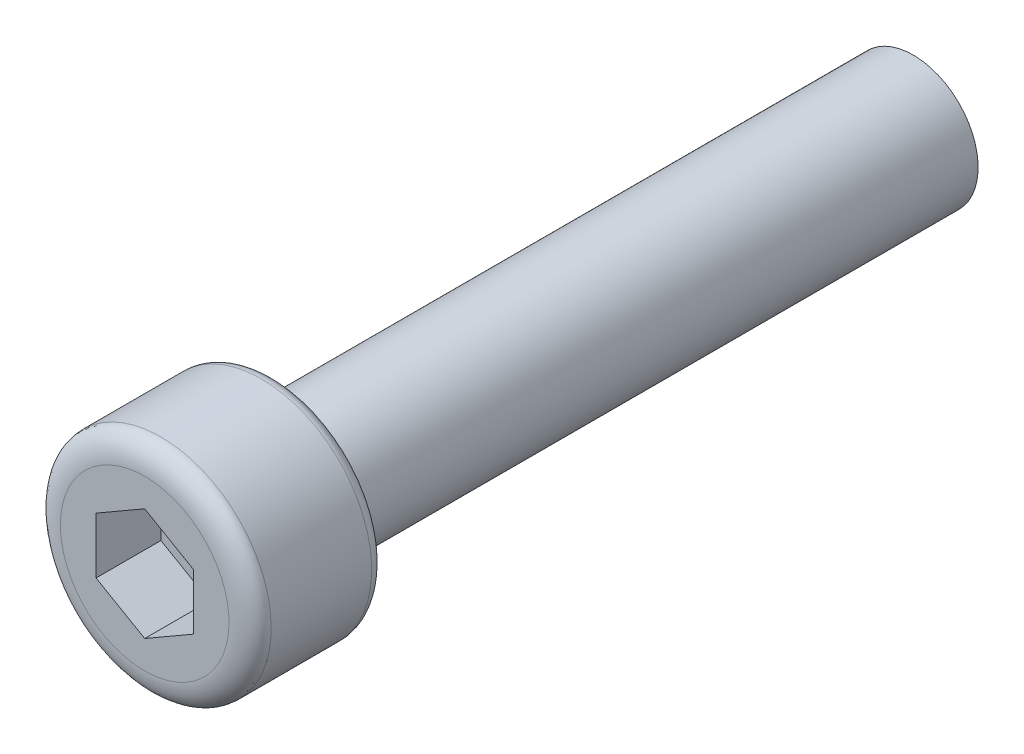
ISO-10303-21;
HEADER;
FILE_DESCRIPTION(('STEP AP214'),'2;1');
FILE_NAME('part.step','',(''),(''),'','','');
FILE_SCHEMA(('AUTOMOTIVE_DESIGN { 1 0 10303 214 1 1 1 1 }'));
ENDSEC;
DATA;
#1=APPLICATION_CONTEXT('core data for automotive mechanical design processes');
#2=APPLICATION_PROTOCOL_DEFINITION('international standard','automotive_design',2000,#1);
#3=PRODUCT_CONTEXT('',#1,'mechanical');
#4=PRODUCT('Part','Part','',(#3));
#5=PRODUCT_RELATED_PRODUCT_CATEGORY('part','',(#4));
#6=PRODUCT_DEFINITION_FORMATION('','',#4);
#7=PRODUCT_DEFINITION_CONTEXT('part definition',#1,'design');
#8=PRODUCT_DEFINITION('design','',#6,#7);
#9=PRODUCT_DEFINITION_SHAPE('','',#8);
#10=(LENGTH_UNIT() NAMED_UNIT(*) SI_UNIT(.MILLI.,.METRE.));
#11=(NAMED_UNIT(*) PLANE_ANGLE_UNIT() SI_UNIT($,.RADIAN.));
#12=(NAMED_UNIT(*) SI_UNIT($,.STERADIAN.) SOLID_ANGLE_UNIT());
#13=UNCERTAINTY_MEASURE_WITH_UNIT(LENGTH_MEASURE(1.E-05),#10,'distance_accuracy_value','');
#14=(GEOMETRIC_REPRESENTATION_CONTEXT(3) GLOBAL_UNCERTAINTY_ASSIGNED_CONTEXT((#13)) GLOBAL_UNIT_ASSIGNED_CONTEXT((#10,
#11,#12)) REPRESENTATION_CONTEXT('',''));
#15=CARTESIAN_POINT('',(0.,0.,0.));
#16=DIRECTION('',(0.,0.,1.));
#17=DIRECTION('',(1.,0.,0.));
#18=AXIS2_PLACEMENT_3D('',#15,#16,#17);
#19=CARTESIAN_POINT('',(0.,0.,12.));
#20=DIRECTION('',(0.,0.,1.));
#21=DIRECTION('',(1.,0.,0.));
#22=AXIS2_PLACEMENT_3D('',#19,#20,#21);
#23=PLANE('',#22);
#24=DIRECTION('',(-0.866025403784439,0.5,0.));
#25=VECTOR('',#24,1.);
#26=CARTESIAN_POINT('',(1.5,0.86602540378444,12.));
#27=LINE('',#26,#25);
#28=CARTESIAN_POINT('',(1.5,0.86602540378444,12.));
#29=VERTEX_POINT('',#28);
#30=CARTESIAN_POINT('',(0.,1.73205080756888,12.));
#31=VERTEX_POINT('',#30);
#32=EDGE_CURVE('E58',#29,#31,#27,.T.);
#33=ORIENTED_EDGE('',*,*,#32,.F.);
#34=DIRECTION('',(0.,1.,0.));
#35=VECTOR('',#34,1.);
#36=CARTESIAN_POINT('',(1.5,-0.866025403784439,12.));
#37=LINE('',#36,#35);
#38=CARTESIAN_POINT('',(1.5,-0.866025403784439,12.));
#39=VERTEX_POINT('',#38);
#40=EDGE_CURVE('E141',#39,#29,#37,.T.);
#41=ORIENTED_EDGE('',*,*,#40,.F.);
#42=DIRECTION('',(0.866025403784439,0.5,0.));
#43=VECTOR('',#42,1.);
#44=CARTESIAN_POINT('',(0.,-1.73205080756888,12.));
#45=LINE('',#44,#43);
#46=CARTESIAN_POINT('',(0.,-1.73205080756888,12.));
#47=VERTEX_POINT('',#46);
#48=EDGE_CURVE('E139',#47,#39,#45,.T.);
#49=ORIENTED_EDGE('',*,*,#48,.F.);
#50=DIRECTION('',(0.866025403784438,-0.5,0.));
#51=VECTOR('',#50,1.);
#52=CARTESIAN_POINT('',(-1.5,-0.866025403784438,12.));
#53=LINE('',#52,#51);
#54=CARTESIAN_POINT('',(-1.5,-0.866025403784438,12.));
#55=VERTEX_POINT('',#54);
#56=EDGE_CURVE('E106',#55,#47,#53,.T.);
#57=ORIENTED_EDGE('',*,*,#56,.F.);
#58=DIRECTION('',(0.,-1.,0.));
#59=VECTOR('',#58,1.);
#60=CARTESIAN_POINT('',(-1.5,0.866025403784439,12.));
#61=LINE('',#60,#59);
#62=CARTESIAN_POINT('',(-1.5,0.866025403784439,12.));
#63=VERTEX_POINT('',#62);
#64=EDGE_CURVE('E135',#63,#55,#61,.T.);
#65=ORIENTED_EDGE('',*,*,#64,.F.);
#66=DIRECTION('',(-0.866025403784439,-0.5,0.));
#67=VECTOR('',#66,1.);
#68=CARTESIAN_POINT('',(0.,1.73205080756888,12.));
#69=LINE('',#68,#67);
#70=EDGE_CURVE('E132',#31,#63,#69,.T.);
#71=ORIENTED_EDGE('',*,*,#70,.F.);
#72=EDGE_LOOP('',(#33,#41,#49,#57,#65,#71));
#73=FACE_BOUND('',#72,.T.);
#74=CARTESIAN_POINT('',(-2.6,0.,12.));
#75=CARTESIAN_POINT('',(-2.6,0.340339195747886,12.));
#76=CARTESIAN_POINT('',(-2.53232895612653,0.680544507086381,12.));
#77=CARTESIAN_POINT('',(-2.27184461293216,1.30940934121209,12.));
#78=CARTESIAN_POINT('',(-2.07913378430194,1.59782147786807,12.));
#79=CARTESIAN_POINT('',(-1.59782147786811,2.07913378430197,12.));
#80=CARTESIAN_POINT('',(-1.30940934121209,2.27184461293216,12.));
#81=CARTESIAN_POINT('',(-0.680544507086378,2.53232895612653,12.));
#82=CARTESIAN_POINT('',(-0.340339195747888,2.6,12.));
#83=CARTESIAN_POINT('',(0.340339195747889,2.6,12.));
#84=CARTESIAN_POINT('',(0.680544507086413,2.53232895612653,12.));
#85=CARTESIAN_POINT('',(1.30940934121205,2.27184461293216,12.));
#86=CARTESIAN_POINT('',(1.5978214778681,2.07913378430191,12.));
#87=CARTESIAN_POINT('',(2.07913378430195,1.59782147786813,12.));
#88=CARTESIAN_POINT('',(2.27184461293214,1.30940934121206,12.));
#89=CARTESIAN_POINT('',(2.53232895612655,0.680544507086403,12.));
#90=CARTESIAN_POINT('',(2.6,0.340339195748112,12.));
#91=CARTESIAN_POINT('',(2.6,-0.340339195748117,12.));
#92=CARTESIAN_POINT('',(2.53232895612663,-0.680544507086149,12.));
#93=CARTESIAN_POINT('',(2.27184461293207,-1.30940934121232,12.));
#94=CARTESIAN_POINT('',(2.0791337843018,-1.59782147786829,12.));
#95=CARTESIAN_POINT('',(1.59782147786825,-2.07913378430177,12.));
#96=CARTESIAN_POINT('',(1.30940934121224,-2.27184461293209,12.));
#97=CARTESIAN_POINT('',(0.68054450708623,-2.53232895612661,12.));
#98=CARTESIAN_POINT('',(0.340339195748087,-2.6,12.));
#99=CARTESIAN_POINT('',(-0.340339195748083,-2.6,12.));
#100=CARTESIAN_POINT('',(-0.680544507086233,-2.53232895612661,12.));
#101=CARTESIAN_POINT('',(-1.30940934121224,-2.27184461293209,12.));
#102=CARTESIAN_POINT('',(-1.59782147786814,-2.07913378430194,12.));
#103=CARTESIAN_POINT('',(-2.0791337843019,-1.59782147786811,12.));
#104=CARTESIAN_POINT('',(-2.27184461293223,-1.30940934121201,12.));
#105=CARTESIAN_POINT('',(-2.53232895612646,-0.680544507086453,12.));
#106=CARTESIAN_POINT('',(-2.6,-0.340339195747891,12.));
#107=CARTESIAN_POINT('',(-2.6,0.,12.));
#108=(BOUNDED_CURVE() B_SPLINE_CURVE(3,(#74,#75,#76,#77,#78,#79,#80,#81,#82,#83,#84,#85,#86,#87,
#88,#89,#90,#91,#92,#93,#94,#95,#96,#97,#98,#99,#100,#101,#102,#103,#104,#105,#106,#107),
.UNSPECIFIED.,.T.,.F.) B_SPLINE_CURVE_WITH_KNOTS((4,2,2,2,2,2,2,2,2,2,2,2,2,2,2,2,4),
(-3.14159265358979,-2.74889357189107,-2.35619449019234,-1.96349540849362,-1.5707963267949,
-1.17809724509617,-0.785398163397448,-0.392699081698724,0.,0.392699081698724,0.785398163397448,
1.17809724509617,1.5707963267949,1.96349540849362,2.35619449019234,2.74889357189107,
3.14159265358979),
.UNSPECIFIED.) CURVE() GEOMETRIC_REPRESENTATION_ITEM() RATIONAL_B_SPLINE_CURVE((1.,1.,1.,1.,1.,
1.,1.,1.,1.,1.,1.,1.,1.,1.,1.,1.,1.,1.,1.,1.,1.,1.,1.,1.,1.,1.,1.,1.,1.,1.,1.,1.,1.,1.)) REPRESENTATION_ITEM(''));
#109=CARTESIAN_POINT('',(-2.6,0.,12.));
#110=VERTEX_POINT('',#109);
#111=EDGE_CURVE('E12',#110,#110,#108,.F.);
#112=ORIENTED_EDGE('',*,*,#111,.T.);
#113=EDGE_LOOP('',(#112));
#114=FACE_BOUND('',#113,.T.);
#115=ADVANCED_FACE('F37',(#73,#114),#23,.T.);
#116=CARTESIAN_POINT('',(0.,0.,-12.));
#117=DIRECTION('',(0.,0.,-1.));
#118=DIRECTION('',(-1.,0.,0.));
#119=AXIS2_PLACEMENT_3D('',#116,#117,#118);
#120=CYLINDRICAL_SURFACE('',#119,3.4);
#121=CARTESIAN_POINT('',(-3.4,0.,11.5));
#122=CARTESIAN_POINT('',(-3.4,-0.445058948285703,11.5));
#123=CARTESIAN_POINT('',(-3.31150709647311,-0.889942816959229,11.5));
#124=CARTESIAN_POINT('',(-2.97087372460365,-1.71230452312338,11.5));
#125=CARTESIAN_POINT('',(-2.71886725639482,-2.08945885567371,11.5));
#126=CARTESIAN_POINT('',(-2.0894588556737,-2.71886725639483,11.5));
#127=CARTESIAN_POINT('',(-1.71230452312369,-2.97087372460351,11.5));
#128=CARTESIAN_POINT('',(-0.889942816958928,-3.31150709647324,11.5));
#129=CARTESIAN_POINT('',(-0.445058948285955,-3.4,11.5));
#130=CARTESIAN_POINT('',(0.44505894828596,-3.4,11.5));
#131=CARTESIAN_POINT('',(0.889942816958893,-3.31150709647325,11.5));
#132=CARTESIAN_POINT('',(1.71230452312372,-2.9708737246035,11.5));
#133=CARTESIAN_POINT('',(2.08945885567389,-2.71886725639464,11.5));
#134=CARTESIAN_POINT('',(2.71886725639464,-2.08945885567389,11.5));
#135=CARTESIAN_POINT('',(2.97087372460347,-1.71230452312381,11.5));
#136=CARTESIAN_POINT('',(3.31150709647329,-0.889942816958808,11.5));
#137=CARTESIAN_POINT('',(3.4,-0.445058948285998,11.5));
#138=CARTESIAN_POINT('',(3.4,0.445058948285993,11.5));
#139=CARTESIAN_POINT('',(3.31150709647316,0.889942816959108,11.5));
#140=CARTESIAN_POINT('',(2.97087372460359,1.7123045231235,11.5));
#141=CARTESIAN_POINT('',(2.71886725639482,2.0894588556737,11.5));
#142=CARTESIAN_POINT('',(2.0894588556737,2.71886725639482,11.5));
#143=CARTESIAN_POINT('',(1.71230452312347,2.9708737246036,11.5));
#144=CARTESIAN_POINT('',(0.889942816959137,3.31150709647315,11.5));
#145=CARTESIAN_POINT('',(0.4450589482857,3.4,11.5));
#146=CARTESIAN_POINT('',(-0.4450589482857,3.4,11.5));
#147=CARTESIAN_POINT('',(-0.889942816959102,3.31150709647316,11.5));
#148=CARTESIAN_POINT('',(-1.71230452312351,2.97087372460359,11.5));
#149=CARTESIAN_POINT('',(-2.08945885567371,2.71886725639482,11.5));
#150=CARTESIAN_POINT('',(-2.71886725639482,2.0894588556737,11.5));
#151=CARTESIAN_POINT('',(-2.97087372460359,1.7123045231235,11.5));
#152=CARTESIAN_POINT('',(-3.31150709647316,0.889942816959118,11.5));
#153=CARTESIAN_POINT('',(-3.4,0.445058948285698,11.5));
#154=CARTESIAN_POINT('',(-3.4,0.,11.5));
#155=(BOUNDED_CURVE() B_SPLINE_CURVE(3,(#121,#122,#123,#124,#125,#126,#127,#128,#129,#130,#131,
#132,#133,#134,#135,#136,#137,#138,#139,#140,#141,#142,#143,#144,#145,#146,#147,#148,#149,#150,
#151,#152,#153,#154),.UNSPECIFIED.,.T.,.F.) B_SPLINE_CURVE_WITH_KNOTS((4,2,2,2,2,2,2,2,2,2,2,2,
2,2,2,2,4),(-3.14159265358979,-2.74889357189107,-2.35619449019234,-1.96349540849362,
-1.5707963267949,-1.17809724509617,-0.785398163397448,-0.392699081698724,0.,0.392699081698724,
0.785398163397448,1.17809724509617,1.5707963267949,1.96349540849362,2.35619449019234,
2.74889357189107,3.14159265358979),
.UNSPECIFIED.) CURVE() GEOMETRIC_REPRESENTATION_ITEM() RATIONAL_B_SPLINE_CURVE((1.,1.,1.,1.,1.,
1.,1.,1.,1.,1.,1.,1.,1.,1.,1.,1.,1.,1.,1.,1.,1.,1.,1.,1.,1.,1.,1.,1.,1.,1.,1.,1.,1.,1.)) REPRESENTATION_ITEM(''));
#156=CARTESIAN_POINT('',(-3.4,0.,11.5));
#157=VERTEX_POINT('',#156);
#158=EDGE_CURVE('E51',#157,#157,#155,.F.);
#159=ORIENTED_EDGE('',*,*,#158,.T.);
#160=EDGE_LOOP('',(#159));
#161=FACE_BOUND('',#160,.T.);
#162=CARTESIAN_POINT('',(0.,0.,8.4));
#163=DIRECTION('',(0.,0.,-1.));
#164=DIRECTION('',(-1.,0.,0.));
#165=AXIS2_PLACEMENT_3D('',#162,#163,#164);
#166=CIRCLE('',#165,3.4);
#167=CARTESIAN_POINT('',(-3.4,0.,8.4));
#168=VERTEX_POINT('',#167);
#169=EDGE_CURVE('E162',#168,#168,#166,.F.);
#170=ORIENTED_EDGE('',*,*,#169,.T.);
#171=EDGE_LOOP('',(#170));
#172=FACE_BOUND('',#171,.T.);
#173=ADVANCED_FACE('F174',(#161,#172),#120,.T.);
#174=CARTESIAN_POINT('',(0.,3.4,8.));
#175=DIRECTION('',(0.,0.,-1.));
#176=DIRECTION('',(-1.,0.,0.));
#177=AXIS2_PLACEMENT_3D('',#174,#175,#176);
#178=PLANE('',#177);
#179=CARTESIAN_POINT('',(0.,0.,8.));
#180=DIRECTION('',(0.,0.,-1.));
#181=DIRECTION('',(-1.,0.,0.));
#182=AXIS2_PLACEMENT_3D('',#179,#180,#181);
#183=CIRCLE('',#182,3.);
#184=CARTESIAN_POINT('',(-3.,0.,8.));
#185=VERTEX_POINT('',#184);
#186=EDGE_CURVE('E159',#185,#185,#183,.T.);
#187=ORIENTED_EDGE('',*,*,#186,.T.);
#188=EDGE_LOOP('',(#187));
#189=FACE_BOUND('',#188,.T.);
#190=CARTESIAN_POINT('',(0.,0.,8.));
#191=DIRECTION('',(0.,0.,-1.));
#192=DIRECTION('',(-1.,0.,0.));
#193=AXIS2_PLACEMENT_3D('',#190,#191,#192);
#194=CIRCLE('',#193,2.);
#195=CARTESIAN_POINT('',(-2.,0.,8.));
#196=VERTEX_POINT('',#195);
#197=EDGE_CURVE('E145',#196,#196,#194,.T.);
#198=ORIENTED_EDGE('',*,*,#197,.F.);
#199=EDGE_LOOP('',(#198));
#200=FACE_BOUND('',#199,.T.);
#201=ADVANCED_FACE('F184',(#189,#200),#178,.T.);
#202=CARTESIAN_POINT('',(0.,0.,-12.));
#203=DIRECTION('',(0.,0.,-1.));
#204=DIRECTION('',(-1.,0.,0.));
#205=AXIS2_PLACEMENT_3D('',#202,#203,#204);
#206=CYLINDRICAL_SURFACE('',#205,2.);
#207=CARTESIAN_POINT('',(0.,0.,-11.7));
#208=DIRECTION('',(0.,0.,-1.));
#209=DIRECTION('',(-1.,0.,0.));
#210=AXIS2_PLACEMENT_3D('',#207,#208,#209);
#211=CIRCLE('',#210,2.);
#212=CARTESIAN_POINT('',(-2.,0.,-11.7));
#213=VERTEX_POINT('',#212);
#214=EDGE_CURVE('E156',#213,#213,#211,.F.);
#215=ORIENTED_EDGE('',*,*,#214,.T.);
#216=EDGE_LOOP('',(#215));
#217=FACE_BOUND('',#216,.T.);
#218=ORIENTED_EDGE('',*,*,#197,.T.);
#219=EDGE_LOOP('',(#218));
#220=FACE_BOUND('',#219,.T.);
#221=ADVANCED_FACE('F233',(#217,#220),#206,.T.);
#222=CARTESIAN_POINT('',(0.,2.,-12.));
#223=DIRECTION('',(0.,0.,-1.));
#224=DIRECTION('',(-1.,0.,0.));
#225=AXIS2_PLACEMENT_3D('',#222,#223,#224);
#226=PLANE('',#225);
#227=CARTESIAN_POINT('',(0.,0.,-12.));
#228=DIRECTION('',(0.,0.,-1.));
#229=DIRECTION('',(-1.,0.,0.));
#230=AXIS2_PLACEMENT_3D('',#227,#228,#229);
#231=CIRCLE('',#230,1.48038475772934);
#232=CARTESIAN_POINT('',(-1.48038475772934,0.,-12.));
#233=VERTEX_POINT('',#232);
#234=EDGE_CURVE('E153',#233,#233,#231,.T.);
#235=ORIENTED_EDGE('',*,*,#234,.T.);
#236=EDGE_LOOP('',(#235));
#237=FACE_BOUND('',#236,.T.);
#238=ADVANCED_FACE('F225',(#237),#226,.T.);
#239=CARTESIAN_POINT('',(0.,0.,-12.));
#240=DIRECTION('',(0.,0.,1.));
#241=DIRECTION('',(1.,0.,0.));
#242=AXIS2_PLACEMENT_3D('',#239,#240,#241);
#243=CONICAL_SURFACE('',#242,1.48038475772934,1.0471975511966);
#244=ORIENTED_EDGE('',*,*,#214,.F.);
#245=EDGE_LOOP('',(#244));
#246=FACE_BOUND('',#245,.T.);
#247=ORIENTED_EDGE('',*,*,#234,.F.);
#248=EDGE_LOOP('',(#247));
#249=FACE_BOUND('',#248,.T.);
#250=ADVANCED_FACE('F191',(#246,#249),#243,.T.);
#251=CARTESIAN_POINT('',(0.,0.,8.4));
#252=DIRECTION('',(0.,0.,-1.));
#253=DIRECTION('',(-1.,0.,0.));
#254=AXIS2_PLACEMENT_3D('',#251,#252,#253);
#255=TOROIDAL_SURFACE('',#254,3.,0.4);
#256=ORIENTED_EDGE('',*,*,#169,.F.);
#257=EDGE_LOOP('',(#256));
#258=FACE_BOUND('',#257,.T.);
#259=ORIENTED_EDGE('',*,*,#186,.F.);
#260=EDGE_LOOP('',(#259));
#261=FACE_BOUND('',#260,.T.);
#262=ADVANCED_FACE('F214',(#258,#261),#255,.T.);
#263=CARTESIAN_POINT('',(-2.6,0.,12.));
#264=CARTESIAN_POINT('',(-2.6,-0.340339195747891,12.));
#265=CARTESIAN_POINT('',(-2.53232895612646,-0.680544507086453,12.));
#266=CARTESIAN_POINT('',(-2.27184461293223,-1.30940934121201,12.));
#267=CARTESIAN_POINT('',(-2.0791337843019,-1.59782147786811,12.));
#268=CARTESIAN_POINT('',(-1.59782147786814,-2.07913378430194,12.));
#269=CARTESIAN_POINT('',(-1.30940934121224,-2.27184461293209,12.));
#270=CARTESIAN_POINT('',(-0.680544507086233,-2.53232895612661,12.));
#271=CARTESIAN_POINT('',(-0.340339195748083,-2.6,12.));
#272=CARTESIAN_POINT('',(0.340339195748087,-2.6,12.));
#273=CARTESIAN_POINT('',(0.68054450708623,-2.53232895612661,12.));
#274=CARTESIAN_POINT('',(1.30940934121224,-2.27184461293209,12.));
#275=CARTESIAN_POINT('',(1.59782147786825,-2.07913378430177,12.));
#276=CARTESIAN_POINT('',(2.0791337843018,-1.59782147786829,12.));
#277=CARTESIAN_POINT('',(2.27184461293207,-1.30940934121232,12.));
#278=CARTESIAN_POINT('',(2.53232895612663,-0.680544507086149,12.));
#279=CARTESIAN_POINT('',(2.6,-0.340339195748117,12.));
#280=CARTESIAN_POINT('',(2.6,0.340339195748112,12.));
#281=CARTESIAN_POINT('',(2.53232895612655,0.680544507086403,12.));
#282=CARTESIAN_POINT('',(2.27184461293214,1.30940934121206,12.));
#283=CARTESIAN_POINT('',(2.07913378430195,1.59782147786813,12.));
#284=CARTESIAN_POINT('',(1.5978214778681,2.07913378430191,12.));
#285=CARTESIAN_POINT('',(1.30940934121205,2.27184461293216,12.));
#286=CARTESIAN_POINT('',(0.680544507086413,2.53232895612653,12.));
#287=CARTESIAN_POINT('',(0.340339195747889,2.6,12.));
#288=CARTESIAN_POINT('',(-0.340339195747888,2.6,12.));
#289=CARTESIAN_POINT('',(-0.680544507086378,2.53232895612653,12.));
#290=CARTESIAN_POINT('',(-1.30940934121209,2.27184461293216,12.));
#291=CARTESIAN_POINT('',(-1.59782147786811,2.07913378430197,12.));
#292=CARTESIAN_POINT('',(-2.07913378430194,1.59782147786807,12.));
#293=CARTESIAN_POINT('',(-2.27184461293216,1.30940934121209,12.));
#294=CARTESIAN_POINT('',(-2.53232895612653,0.680544507086381,12.));
#295=CARTESIAN_POINT('',(-2.6,0.340339195747886,12.));
#296=CARTESIAN_POINT('',(-2.6,0.,12.));
#297=CARTESIAN_POINT('',(-3.4,0.,12.));
#298=CARTESIAN_POINT('',(-3.4,-0.445058948285703,12.));
#299=CARTESIAN_POINT('',(-3.31150709647311,-0.889942816959199,12.));
#300=CARTESIAN_POINT('',(-2.97087372460365,-1.71230452312341,12.));
#301=CARTESIAN_POINT('',(-2.71886725639478,-2.08945885567367,12.));
#302=CARTESIAN_POINT('',(-2.08945885567374,-2.71886725639486,12.));
#303=CARTESIAN_POINT('',(-1.7123045231237,-2.97087372460352,12.));
#304=CARTESIAN_POINT('',(-0.889942816958926,-3.31150709647324,12.));
#305=CARTESIAN_POINT('',(-0.445058948285955,-3.40000000000001,12.));
#306=CARTESIAN_POINT('',(0.44505894828596,-3.40000000000001,12.));
#307=CARTESIAN_POINT('',(0.889942816958886,-3.31150709647324,12.));
#308=CARTESIAN_POINT('',(1.71230452312373,-2.97087372460352,12.));
#309=CARTESIAN_POINT('',(2.08945885567385,-2.71886725639461,12.));
#310=CARTESIAN_POINT('',(2.71886725639468,-2.08945885567392,12.));
#311=CARTESIAN_POINT('',(2.9708737246035,-1.71230452312379,12.));
#312=CARTESIAN_POINT('',(3.31150709647326,-0.889942816958827,12.));
#313=CARTESIAN_POINT('',(3.4,-0.445058948285998,12.));
#314=CARTESIAN_POINT('',(3.4,0.445058948285993,12.));
#315=CARTESIAN_POINT('',(3.31150709647311,0.889942816959118,12.));
#316=CARTESIAN_POINT('',(2.97087372460364,1.71230452312349,12.));
#317=CARTESIAN_POINT('',(2.71886725639482,2.0894588556737,12.));
#318=CARTESIAN_POINT('',(2.0894588556737,2.71886725639482,12.));
#319=CARTESIAN_POINT('',(1.71230452312347,2.97087372460359,12.));
#320=CARTESIAN_POINT('',(0.889942816959142,3.31150709647316,12.));
#321=CARTESIAN_POINT('',(0.445058948285701,3.4,12.));
#322=CARTESIAN_POINT('',(-0.4450589482857,3.4,12.));
#323=CARTESIAN_POINT('',(-0.88994281695907,3.31150709647308,12.));
#324=CARTESIAN_POINT('',(-1.71230452312354,2.97087372460367,12.));
#325=CARTESIAN_POINT('',(-2.08945885567374,2.71886725639486,12.));
#326=CARTESIAN_POINT('',(-2.71886725639479,2.08945885567366,12.));
#327=CARTESIAN_POINT('',(-2.97087372460364,1.71230452312349,12.));
#328=CARTESIAN_POINT('',(-3.31150709647311,0.889942816959129,12.));
#329=CARTESIAN_POINT('',(-3.4,0.445058948285698,12.));
#330=CARTESIAN_POINT('',(-3.4,0.,12.));
#331=CARTESIAN_POINT('',(-3.4,0.,11.5));
#332=CARTESIAN_POINT('',(-3.4,-0.445058948285703,11.5));
#333=CARTESIAN_POINT('',(-3.31150709647311,-0.889942816959229,11.5));
#334=CARTESIAN_POINT('',(-2.97087372460365,-1.71230452312338,11.5));
#335=CARTESIAN_POINT('',(-2.71886725639482,-2.08945885567371,11.5));
#336=CARTESIAN_POINT('',(-2.0894588556737,-2.71886725639483,11.5));
#337=CARTESIAN_POINT('',(-1.71230452312369,-2.97087372460351,11.5));
#338=CARTESIAN_POINT('',(-0.889942816958928,-3.31150709647324,11.5));
#339=CARTESIAN_POINT('',(-0.445058948285955,-3.4,11.5));
#340=CARTESIAN_POINT('',(0.44505894828596,-3.4,11.5));
#341=CARTESIAN_POINT('',(0.889942816958893,-3.31150709647325,11.5));
#342=CARTESIAN_POINT('',(1.71230452312372,-2.9708737246035,11.5));
#343=CARTESIAN_POINT('',(2.08945885567389,-2.71886725639464,11.5));
#344=CARTESIAN_POINT('',(2.71886725639464,-2.08945885567389,11.5));
#345=CARTESIAN_POINT('',(2.97087372460347,-1.71230452312381,11.5));
#346=CARTESIAN_POINT('',(3.31150709647329,-0.889942816958808,11.5));
#347=CARTESIAN_POINT('',(3.4,-0.445058948285998,11.5));
#348=CARTESIAN_POINT('',(3.4,0.445058948285993,11.5));
#349=CARTESIAN_POINT('',(3.31150709647316,0.889942816959108,11.5));
#350=CARTESIAN_POINT('',(2.97087372460359,1.7123045231235,11.5));
#351=CARTESIAN_POINT('',(2.71886725639482,2.0894588556737,11.5));
#352=CARTESIAN_POINT('',(2.0894588556737,2.71886725639482,11.5));
#353=CARTESIAN_POINT('',(1.71230452312347,2.9708737246036,11.5));
#354=CARTESIAN_POINT('',(0.889942816959137,3.31150709647315,11.5));
#355=CARTESIAN_POINT('',(0.4450589482857,3.4,11.5));
#356=CARTESIAN_POINT('',(-0.4450589482857,3.4,11.5));
#357=CARTESIAN_POINT('',(-0.889942816959102,3.31150709647316,11.5));
#358=CARTESIAN_POINT('',(-1.71230452312351,2.97087372460359,11.5));
#359=CARTESIAN_POINT('',(-2.08945885567371,2.71886725639482,11.5));
#360=CARTESIAN_POINT('',(-2.71886725639482,2.0894588556737,11.5));
#361=CARTESIAN_POINT('',(-2.97087372460359,1.7123045231235,11.5));
#362=CARTESIAN_POINT('',(-3.31150709647316,0.889942816959118,11.5));
#363=CARTESIAN_POINT('',(-3.4,0.445058948285698,11.5));
#364=CARTESIAN_POINT('',(-3.4,0.,11.5));
#365=(BOUNDED_SURFACE() B_SPLINE_SURFACE(2,3,((#263,#264,#265,#266,#267,#268,#269,#270,#271,
#272,#273,#274,#275,#276,#277,#278,#279,#280,#281,#282,#283,#284,#285,#286,#287,#288,#289,#290,
#291,#292,#293,#294,#295,#296),(#297,#298,#299,#300,#301,#302,#303,#304,#305,#306,#307,#308,
#309,#310,#311,#312,#313,#314,#315,#316,#317,#318,#319,#320,#321,#322,#323,#324,#325,#326,#327,
#328,#329,#330),(#331,#332,#333,#334,#335,#336,#337,#338,#339,#340,#341,#342,#343,#344,#345,
#346,#347,#348,#349,#350,#351,#352,#353,#354,#355,#356,#357,#358,#359,#360,#361,#362,#363,
#364)),.UNSPECIFIED.,.F.,.T.,.F.) B_SPLINE_SURFACE_WITH_KNOTS((3,3),(4,2,2,2,2,2,2,2,2,2,2,2,2,
2,2,2,4),(0.,1.),(-3.14159265358979,-2.74889357189107,-2.35619449019234,-1.96349540849362,
-1.5707963267949,-1.17809724509617,-0.785398163397448,-0.392699081698724,0.,0.392699081698724,
0.785398163397448,1.17809724509617,1.5707963267949,1.96349540849362,2.35619449019234,
2.74889357189107,3.14159265358979),
.UNSPECIFIED.) GEOMETRIC_REPRESENTATION_ITEM() RATIONAL_B_SPLINE_SURFACE(((1.,1.,1.,1.,1.,1.,1.,
1.,1.,1.,1.,1.,1.,1.,1.,1.,1.,1.,1.,1.,1.,1.,1.,1.,1.,1.,1.,1.,1.,1.,1.,1.,1.,1.),
(0.707106781186547,0.707106781186547,0.707106781186547,0.707106781186547,0.707106781186547,
0.707106781186547,0.707106781186547,0.707106781186547,0.707106781186547,0.707106781186547,
0.707106781186547,0.707106781186547,0.707106781186547,0.707106781186547,0.707106781186547,
0.707106781186547,0.707106781186547,0.707106781186547,0.707106781186547,0.707106781186547,
0.707106781186547,0.707106781186547,0.707106781186547,0.707106781186547,0.707106781186547,
0.707106781186547,0.707106781186547,0.707106781186547,0.707106781186547,0.707106781186547,
0.707106781186547,0.707106781186547,0.707106781186547,0.707106781186547),(1.,1.,1.,1.,1.,1.,1.,
1.,1.,1.,1.,1.,1.,1.,1.,1.,1.,1.,1.,1.,1.,1.,1.,1.,1.,1.,1.,1.,1.,1.,1.,1.,1.,1.))) REPRESENTATION_ITEM('') SURFACE());
#366=ORIENTED_EDGE('',*,*,#111,.F.);
#367=EDGE_LOOP('',(#366));
#368=FACE_BOUND('',#367,.T.);
#369=ORIENTED_EDGE('',*,*,#158,.F.);
#370=EDGE_LOOP('',(#369));
#371=FACE_BOUND('',#370,.T.);
#372=ADVANCED_FACE('F40',(#368,#371),#365,.T.);
#373=CARTESIAN_POINT('',(1.5,0.86602540378444,10.));
#374=DIRECTION('',(0.5,0.866025403784439,0.));
#375=DIRECTION('',(-0.866025403784439,0.5,0.));
#376=AXIS2_PLACEMENT_3D('',#373,#374,#375);
#377=PLANE('',#376);
#378=ORIENTED_EDGE('',*,*,#32,.T.);
#379=DIRECTION('',(0.,0.,1.));
#380=VECTOR('',#379,1.);
#381=CARTESIAN_POINT('',(0.,1.73205080756888,10.));
#382=LINE('',#381,#380);
#383=CARTESIAN_POINT('',(0.,1.73205080756888,10.));
#384=VERTEX_POINT('',#383);
#385=EDGE_CURVE('E88',#384,#31,#382,.T.);
#386=ORIENTED_EDGE('',*,*,#385,.F.);
#387=DIRECTION('',(-0.866025403784439,0.5,0.));
#388=VECTOR('',#387,1.);
#389=CARTESIAN_POINT('',(1.5,0.86602540378444,10.));
#390=LINE('',#389,#388);
#391=CARTESIAN_POINT('',(1.5,0.86602540378444,10.));
#392=VERTEX_POINT('',#391);
#393=EDGE_CURVE('E143',#392,#384,#390,.T.);
#394=ORIENTED_EDGE('',*,*,#393,.F.);
#395=DIRECTION('',(0.,0.,1.));
#396=VECTOR('',#395,1.);
#397=CARTESIAN_POINT('',(1.5,0.86602540378444,10.));
#398=LINE('',#397,#396);
#399=EDGE_CURVE('E66',#392,#29,#398,.T.);
#400=ORIENTED_EDGE('',*,*,#399,.T.);
#401=EDGE_LOOP('',(#378,#386,#394,#400));
#402=FACE_BOUND('',#401,.T.);
#403=ADVANCED_FACE('F213',(#402),#377,.F.);
#404=CARTESIAN_POINT('',(1.5,-0.866025403784439,10.));
#405=DIRECTION('',(1.,0.,0.));
#406=DIRECTION('',(0.,0.,-1.));
#407=AXIS2_PLACEMENT_3D('',#404,#405,#406);
#408=PLANE('',#407);
#409=ORIENTED_EDGE('',*,*,#40,.T.);
#410=ORIENTED_EDGE('',*,*,#399,.F.);
#411=DIRECTION('',(0.,1.,0.));
#412=VECTOR('',#411,1.);
#413=CARTESIAN_POINT('',(1.5,-0.866025403784439,10.));
#414=LINE('',#413,#412);
#415=CARTESIAN_POINT('',(1.5,-0.866025403784439,10.));
#416=VERTEX_POINT('',#415);
#417=EDGE_CURVE('E118',#416,#392,#414,.T.);
#418=ORIENTED_EDGE('',*,*,#417,.F.);
#419=DIRECTION('',(0.,0.,1.));
#420=VECTOR('',#419,1.);
#421=CARTESIAN_POINT('',(1.5,-0.866025403784439,10.));
#422=LINE('',#421,#420);
#423=EDGE_CURVE('E110',#416,#39,#422,.T.);
#424=ORIENTED_EDGE('',*,*,#423,.T.);
#425=EDGE_LOOP('',(#409,#410,#418,#424));
#426=FACE_BOUND('',#425,.T.);
#427=ADVANCED_FACE('F219',(#426),#408,.F.);
#428=CARTESIAN_POINT('',(0.,-1.73205080756888,10.));
#429=DIRECTION('',(0.5,-0.866025403784439,0.));
#430=DIRECTION('',(0.866025403784439,0.5,0.));
#431=AXIS2_PLACEMENT_3D('',#428,#429,#430);
#432=PLANE('',#431);
#433=ORIENTED_EDGE('',*,*,#48,.T.);
#434=ORIENTED_EDGE('',*,*,#423,.F.);
#435=DIRECTION('',(0.866025403784439,0.5,0.));
#436=VECTOR('',#435,1.);
#437=CARTESIAN_POINT('',(0.,-1.73205080756888,10.));
#438=LINE('',#437,#436);
#439=CARTESIAN_POINT('',(0.,-1.73205080756888,10.));
#440=VERTEX_POINT('',#439);
#441=EDGE_CURVE('E114',#440,#416,#438,.T.);
#442=ORIENTED_EDGE('',*,*,#441,.F.);
#443=DIRECTION('',(0.,0.,1.));
#444=VECTOR('',#443,1.);
#445=CARTESIAN_POINT('',(0.,-1.73205080756888,10.));
#446=LINE('',#445,#444);
#447=EDGE_CURVE('E99',#440,#47,#446,.T.);
#448=ORIENTED_EDGE('',*,*,#447,.T.);
#449=EDGE_LOOP('',(#433,#434,#442,#448));
#450=FACE_BOUND('',#449,.T.);
#451=ADVANCED_FACE('F115',(#450),#432,.F.);
#452=CARTESIAN_POINT('',(-1.5,-0.866025403784438,10.));
#453=DIRECTION('',(-0.5,-0.866025403784439,0.));
#454=DIRECTION('',(0.866025403784439,-0.5,0.));
#455=AXIS2_PLACEMENT_3D('',#452,#453,#454);
#456=PLANE('',#455);
#457=ORIENTED_EDGE('',*,*,#56,.T.);
#458=ORIENTED_EDGE('',*,*,#447,.F.);
#459=DIRECTION('',(0.866025403784438,-0.5,0.));
#460=VECTOR('',#459,1.);
#461=CARTESIAN_POINT('',(-1.5,-0.866025403784438,10.));
#462=LINE('',#461,#460);
#463=CARTESIAN_POINT('',(-1.5,-0.866025403784438,10.));
#464=VERTEX_POINT('',#463);
#465=EDGE_CURVE('E103',#464,#440,#462,.T.);
#466=ORIENTED_EDGE('',*,*,#465,.F.);
#467=DIRECTION('',(0.,0.,1.));
#468=VECTOR('',#467,1.);
#469=CARTESIAN_POINT('',(-1.5,-0.866025403784438,10.));
#470=LINE('',#469,#468);
#471=EDGE_CURVE('E111',#464,#55,#470,.T.);
#472=ORIENTED_EDGE('',*,*,#471,.T.);
#473=EDGE_LOOP('',(#457,#458,#466,#472));
#474=FACE_BOUND('',#473,.T.);
#475=ADVANCED_FACE('F101',(#474),#456,.F.);
#476=CARTESIAN_POINT('',(-1.5,0.866025403784439,10.));
#477=DIRECTION('',(-1.,0.,0.));
#478=DIRECTION('',(0.,0.,1.));
#479=AXIS2_PLACEMENT_3D('',#476,#477,#478);
#480=PLANE('',#479);
#481=ORIENTED_EDGE('',*,*,#64,.T.);
#482=ORIENTED_EDGE('',*,*,#471,.F.);
#483=DIRECTION('',(0.,-1.,0.));
#484=VECTOR('',#483,1.);
#485=CARTESIAN_POINT('',(-1.5,0.866025403784439,10.));
#486=LINE('',#485,#484);
#487=CARTESIAN_POINT('',(-1.5,0.866025403784439,10.));
#488=VERTEX_POINT('',#487);
#489=EDGE_CURVE('E124',#488,#464,#486,.T.);
#490=ORIENTED_EDGE('',*,*,#489,.F.);
#491=DIRECTION('',(0.,0.,1.));
#492=VECTOR('',#491,1.);
#493=CARTESIAN_POINT('',(-1.5,0.866025403784439,10.));
#494=LINE('',#493,#492);
#495=EDGE_CURVE('E148',#488,#63,#494,.T.);
#496=ORIENTED_EDGE('',*,*,#495,.T.);
#497=EDGE_LOOP('',(#481,#482,#490,#496));
#498=FACE_BOUND('',#497,.T.);
#499=ADVANCED_FACE('F247',(#498),#480,.F.);
#500=CARTESIAN_POINT('',(0.,1.73205080756888,10.));
#501=DIRECTION('',(-0.5,0.866025403784439,0.));
#502=DIRECTION('',(-0.866025403784439,-0.5,0.));
#503=AXIS2_PLACEMENT_3D('',#500,#501,#502);
#504=PLANE('',#503);
#505=ORIENTED_EDGE('',*,*,#70,.T.);
#506=ORIENTED_EDGE('',*,*,#495,.F.);
#507=DIRECTION('',(-0.866025403784439,-0.5,0.));
#508=VECTOR('',#507,1.);
#509=CARTESIAN_POINT('',(0.,1.73205080756888,10.));
#510=LINE('',#509,#508);
#511=EDGE_CURVE('E126',#384,#488,#510,.T.);
#512=ORIENTED_EDGE('',*,*,#511,.F.);
#513=ORIENTED_EDGE('',*,*,#385,.T.);
#514=EDGE_LOOP('',(#505,#506,#512,#513));
#515=FACE_BOUND('',#514,.T.);
#516=ADVANCED_FACE('F244',(#515),#504,.F.);
#517=CARTESIAN_POINT('',(0.,0.,10.));
#518=DIRECTION('',(0.,0.,1.));
#519=DIRECTION('',(1.,0.,0.));
#520=AXIS2_PLACEMENT_3D('',#517,#518,#519);
#521=PLANE('',#520);
#522=ORIENTED_EDGE('',*,*,#393,.T.);
#523=ORIENTED_EDGE('',*,*,#511,.T.);
#524=ORIENTED_EDGE('',*,*,#489,.T.);
#525=ORIENTED_EDGE('',*,*,#465,.T.);
#526=ORIENTED_EDGE('',*,*,#441,.T.);
#527=ORIENTED_EDGE('',*,*,#417,.T.);
#528=EDGE_LOOP('',(#522,#523,#524,#525,#526,#527));
#529=FACE_BOUND('',#528,.T.);
#530=ADVANCED_FACE('F121',(#529),#521,.T.);
#531=CLOSED_SHELL('',(#115,#173,#201,#221,#238,#250,#262,#372,#403,#427,#451,#475,#499,#516,#530));
#532=MANIFOLD_SOLID_BREP('B2',#531);
#533=ADVANCED_BREP_SHAPE_REPRESENTATION('',(#18,#532),#14);
#534=SHAPE_DEFINITION_REPRESENTATION(#9,#533);
ENDSEC;
END-ISO-10303-21;
